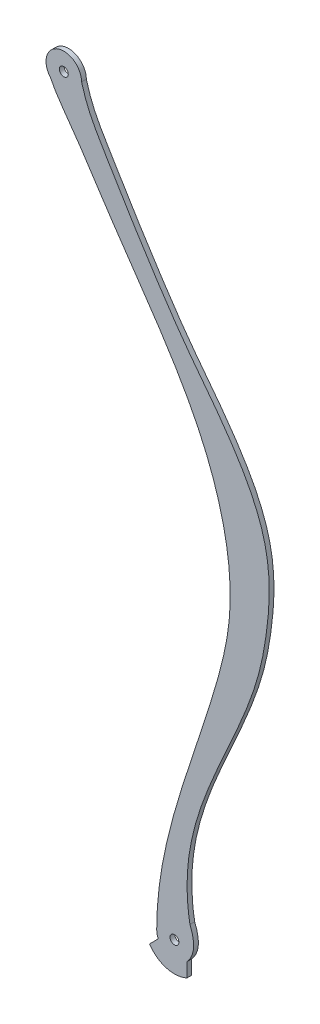
ISO-10303-21;
HEADER;
FILE_DESCRIPTION(('STEP AP214'),'2;1');
FILE_NAME('part.step','',(''),(''),'','','');
FILE_SCHEMA(('AUTOMOTIVE_DESIGN { 1 0 10303 214 1 1 1 1 }'));
ENDSEC;
DATA;
#1=APPLICATION_CONTEXT('core data for automotive mechanical design processes');
#2=APPLICATION_PROTOCOL_DEFINITION('international standard','automotive_design',2000,#1);
#3=PRODUCT_CONTEXT('',#1,'mechanical');
#4=PRODUCT('Part','Part','',(#3));
#5=PRODUCT_RELATED_PRODUCT_CATEGORY('part','',(#4));
#6=PRODUCT_DEFINITION_FORMATION('','',#4);
#7=PRODUCT_DEFINITION_CONTEXT('part definition',#1,'design');
#8=PRODUCT_DEFINITION('design','',#6,#7);
#9=PRODUCT_DEFINITION_SHAPE('','',#8);
#10=(LENGTH_UNIT() NAMED_UNIT(*) SI_UNIT(.MILLI.,.METRE.));
#11=(NAMED_UNIT(*) PLANE_ANGLE_UNIT() SI_UNIT($,.RADIAN.));
#12=(NAMED_UNIT(*) SI_UNIT($,.STERADIAN.) SOLID_ANGLE_UNIT());
#13=UNCERTAINTY_MEASURE_WITH_UNIT(LENGTH_MEASURE(1.E-05),#10,'distance_accuracy_value','');
#14=(GEOMETRIC_REPRESENTATION_CONTEXT(3) GLOBAL_UNCERTAINTY_ASSIGNED_CONTEXT((#13)) GLOBAL_UNIT_ASSIGNED_CONTEXT((#10,
#11,#12)) REPRESENTATION_CONTEXT('',''));
#15=CARTESIAN_POINT('',(0.,0.,0.));
#16=DIRECTION('',(0.,0.,1.));
#17=DIRECTION('',(1.,0.,0.));
#18=AXIS2_PLACEMENT_3D('',#15,#16,#17);
#19=CARTESIAN_POINT('',(42.5704411222653,-227.946776929195,1.6));
#20=CARTESIAN_POINT('',(45.4783553267568,-234.955262518394,1.6));
#21=CARTESIAN_POINT('',(41.5394779205616,-239.288693536524,1.6));
#22=B_SPLINE_CURVE_WITH_KNOTS('',2,(#19,#20,#21),.UNSPECIFIED.,.F.,.F.,(3,3),(0.,1.),.UNSPECIFIED.);
#23=DIRECTION('',(0.,0.,-1.));
#24=VECTOR('',#23,1.);
#25=SURFACE_OF_LINEAR_EXTRUSION('',#22,#24);
#26=CARTESIAN_POINT('',(42.5704411222653,-227.946776929195,0.));
#27=CARTESIAN_POINT('',(45.4783553267568,-234.955262518394,0.));
#28=CARTESIAN_POINT('',(41.5394779205616,-239.288693536524,0.));
#29=B_SPLINE_CURVE_WITH_KNOTS('',2,(#26,#27,#28),.UNSPECIFIED.,.F.,.F.,(3,3),(0.,1.),.UNSPECIFIED.);
#30=CARTESIAN_POINT('',(42.5704411222653,-227.946776929195,0.));
#31=VERTEX_POINT('',#30);
#32=CARTESIAN_POINT('',(41.5394779205616,-239.288693536524,0.));
#33=VERTEX_POINT('',#32);
#34=EDGE_CURVE('E138',#31,#33,#29,.T.);
#35=ORIENTED_EDGE('',*,*,#34,.F.);
#36=DIRECTION('',(0.,0.,-1.));
#37=VECTOR('',#36,1.);
#38=CARTESIAN_POINT('',(42.5704411222653,-227.946776929195,1.6));
#39=LINE('',#38,#37);
#40=CARTESIAN_POINT('',(42.5704411222653,-227.946776929195,1.6));
#41=VERTEX_POINT('',#40);
#42=EDGE_CURVE('E11',#41,#31,#39,.T.);
#43=ORIENTED_EDGE('',*,*,#42,.F.);
#44=CARTESIAN_POINT('',(41.5394779205616,-239.288693536524,1.6));
#45=VERTEX_POINT('',#44);
#46=EDGE_CURVE('E177',#41,#45,#22,.T.);
#47=ORIENTED_EDGE('',*,*,#46,.T.);
#48=DIRECTION('',(0.,0.,-1.));
#49=VECTOR('',#48,1.);
#50=CARTESIAN_POINT('',(41.5394779205616,-239.288693536524,1.6));
#51=LINE('',#50,#49);
#52=EDGE_CURVE('E53',#45,#33,#51,.T.);
#53=ORIENTED_EDGE('',*,*,#52,.T.);
#54=EDGE_LOOP('',(#35,#43,#47,#53));
#55=FACE_BOUND('',#54,.T.);
#56=ADVANCED_FACE('F36',(#55),#25,.T.);
#57=CARTESIAN_POINT('',(6.,0.,1.6));
#58=CARTESIAN_POINT('',(7.76386208286006,-6.61193534295752,1.6));
#59=CARTESIAN_POINT('',(16.7739174488545,-21.8118978722191,1.6));
#60=CARTESIAN_POINT('',(27.4635683429947,-39.5793997627197,1.6));
#61=CARTESIAN_POINT('',(42.0147268676152,-60.9068216002465,1.6));
#62=CARTESIAN_POINT('',(50.4000416978606,-71.2722804910203,1.6));
#63=CARTESIAN_POINT('',(68.5781614765407,-97.575861314017,1.6));
#64=CARTESIAN_POINT('',(71.3531265188425,-113.361048841766,1.6));
#65=CARTESIAN_POINT('',(61.9761604637949,-167.143867847091,1.6));
#66=CARTESIAN_POINT('',(36.5746544062889,-194.797637863706,1.6));
#67=CARTESIAN_POINT('',(42.5704411222653,-227.946776929195,1.6));
#68=B_SPLINE_CURVE_WITH_KNOTS('',3,(#57,#58,#59,#60,#61,#62,#63,#64,#65,#66,#67),.UNSPECIFIED.,
.F.,.F.,(4,1,1,1,1,1,1,1,4),(0.,0.0683192614589029,0.240751678098302,0.269358498196008,
0.344939799742638,0.384133739371875,0.622103954859139,0.655427619881835,1.),.UNSPECIFIED.);
#69=DIRECTION('',(0.,0.,-1.));
#70=VECTOR('',#69,1.);
#71=SURFACE_OF_LINEAR_EXTRUSION('',#68,#70);
#72=CARTESIAN_POINT('',(6.,0.,0.));
#73=CARTESIAN_POINT('',(7.76386208286006,-6.61193534295752,0.));
#74=CARTESIAN_POINT('',(16.7739174488545,-21.8118978722191,0.));
#75=CARTESIAN_POINT('',(27.4635683429947,-39.5793997627197,0.));
#76=CARTESIAN_POINT('',(42.0147268676152,-60.9068216002465,0.));
#77=CARTESIAN_POINT('',(50.4000416978606,-71.2722804910203,0.));
#78=CARTESIAN_POINT('',(68.5781614765407,-97.575861314017,0.));
#79=CARTESIAN_POINT('',(71.3531265188425,-113.361048841766,0.));
#80=CARTESIAN_POINT('',(61.9761604637949,-167.143867847091,0.));
#81=CARTESIAN_POINT('',(36.5746544062889,-194.797637863706,0.));
#82=CARTESIAN_POINT('',(42.5704411222653,-227.946776929195,0.));
#83=B_SPLINE_CURVE_WITH_KNOTS('',3,(#72,#73,#74,#75,#76,#77,#78,#79,#80,#81,#82),.UNSPECIFIED.,
.F.,.F.,(4,1,1,1,1,1,1,1,4),(0.,0.0683192614589029,0.240751678098302,0.269358498196008,
0.344939799742638,0.384133739371875,0.622103954859139,0.655427619881835,1.),.UNSPECIFIED.);
#84=CARTESIAN_POINT('',(6.,0.,0.));
#85=VERTEX_POINT('',#84);
#86=EDGE_CURVE('E142',#85,#31,#83,.T.);
#87=ORIENTED_EDGE('',*,*,#86,.F.);
#88=DIRECTION('',(0.,0.,-1.));
#89=VECTOR('',#88,1.);
#90=CARTESIAN_POINT('',(6.,0.,1.6));
#91=LINE('',#90,#89);
#92=CARTESIAN_POINT('',(6.,0.,1.6));
#93=VERTEX_POINT('',#92);
#94=EDGE_CURVE('E45',#93,#85,#91,.T.);
#95=ORIENTED_EDGE('',*,*,#94,.F.);
#96=EDGE_CURVE('E202',#93,#41,#68,.T.);
#97=ORIENTED_EDGE('',*,*,#96,.T.);
#98=ORIENTED_EDGE('',*,*,#42,.T.);
#99=EDGE_LOOP('',(#87,#95,#97,#98));
#100=FACE_BOUND('',#99,.T.);
#101=ADVANCED_FACE('F201',(#100),#71,.T.);
#102=CARTESIAN_POINT('',(0.,0.,1.6));
#103=DIRECTION('',(0.,0.,-1.));
#104=DIRECTION('',(-1.,0.,0.));
#105=AXIS2_PLACEMENT_3D('',#102,#103,#104);
#106=CYLINDRICAL_SURFACE('',#105,6.);
#107=CARTESIAN_POINT('',(0.,0.,0.));
#108=DIRECTION('',(0.,0.,1.));
#109=DIRECTION('',(1.,0.,0.));
#110=AXIS2_PLACEMENT_3D('',#107,#108,#109);
#111=CIRCLE('',#110,6.);
#112=CARTESIAN_POINT('',(-4.4798144967741,-3.99139851111018,0.));
#113=VERTEX_POINT('',#112);
#114=EDGE_CURVE('E150',#85,#113,#111,.T.);
#115=ORIENTED_EDGE('',*,*,#114,.T.);
#116=DIRECTION('',(0.,0.,-1.));
#117=VECTOR('',#116,1.);
#118=CARTESIAN_POINT('',(-4.4798144967741,-3.99139851111018,1.6));
#119=LINE('',#118,#117);
#120=CARTESIAN_POINT('',(-4.4798144967741,-3.99139851111018,1.6));
#121=VERTEX_POINT('',#120);
#122=EDGE_CURVE('E184',#121,#113,#119,.T.);
#123=ORIENTED_EDGE('',*,*,#122,.F.);
#124=CARTESIAN_POINT('',(0.,0.,1.6));
#125=DIRECTION('',(0.,0.,1.));
#126=DIRECTION('',(1.,0.,0.));
#127=AXIS2_PLACEMENT_3D('',#124,#125,#126);
#128=CIRCLE('',#127,6.);
#129=EDGE_CURVE('E191',#93,#121,#128,.T.);
#130=ORIENTED_EDGE('',*,*,#129,.F.);
#131=ORIENTED_EDGE('',*,*,#94,.T.);
#132=EDGE_LOOP('',(#115,#123,#130,#131));
#133=FACE_BOUND('',#132,.T.);
#134=ADVANCED_FACE('F189',(#133),#106,.T.);
#135=CARTESIAN_POINT('',(-4.4798144967741,-3.99139851111018,1.6));
#136=CARTESIAN_POINT('',(-2.84838487567931,-7.43979884449677,1.6));
#137=CARTESIAN_POINT('',(4.36676713544047,-16.8942488774789,1.6));
#138=CARTESIAN_POINT('',(22.2675687815332,-45.5318443283706,1.6));
#139=CARTESIAN_POINT('',(49.5545722076309,-80.5433327382024,1.6));
#140=CARTESIAN_POINT('',(58.7070886496613,-124.756359647823,1.6));
#141=CARTESIAN_POINT('',(46.7827591376071,-173.478130540099,1.6));
#142=CARTESIAN_POINT('',(31.3878425658591,-206.976572759324,1.6));
#143=CARTESIAN_POINT('',(31.3433954917025,-235.,1.6));
#144=B_SPLINE_CURVE_WITH_KNOTS('',3,(#135,#136,#137,#138,#139,#140,#141,#142,#143),
.UNSPECIFIED.,.F.,.F.,(4,1,1,1,1,1,4),(0.0158945336217027,0.0599627114776733,0.161342902171643,
0.40983356742642,0.582005186834429,0.66809639181976,1.),.UNSPECIFIED.);
#145=DIRECTION('',(0.,0.,-1.));
#146=VECTOR('',#145,1.);
#147=SURFACE_OF_LINEAR_EXTRUSION('',#144,#146);
#148=CARTESIAN_POINT('',(-4.4798144967741,-3.99139851111018,0.));
#149=CARTESIAN_POINT('',(-2.84838487567931,-7.43979884449677,0.));
#150=CARTESIAN_POINT('',(4.36676713544047,-16.8942488774789,0.));
#151=CARTESIAN_POINT('',(22.2675687815332,-45.5318443283706,0.));
#152=CARTESIAN_POINT('',(49.5545722076309,-80.5433327382024,0.));
#153=CARTESIAN_POINT('',(58.7070886496613,-124.756359647823,0.));
#154=CARTESIAN_POINT('',(46.7827591376071,-173.478130540099,0.));
#155=CARTESIAN_POINT('',(31.3878425658591,-206.976572759324,0.));
#156=CARTESIAN_POINT('',(31.3433954917025,-235.,0.));
#157=B_SPLINE_CURVE_WITH_KNOTS('',3,(#148,#149,#150,#151,#152,#153,#154,#155,#156),
.UNSPECIFIED.,.F.,.F.,(4,1,1,1,1,1,4),(0.0158945336217027,0.0599627114776733,0.161342902171643,
0.40983356742642,0.582005186834429,0.66809639181976,1.),.UNSPECIFIED.);
#158=CARTESIAN_POINT('',(31.3433954917025,-235.,0.));
#159=VERTEX_POINT('',#158);
#160=EDGE_CURVE('E155',#113,#159,#157,.T.);
#161=ORIENTED_EDGE('',*,*,#160,.T.);
#162=DIRECTION('',(0.,0.,-1.));
#163=VECTOR('',#162,1.);
#164=CARTESIAN_POINT('',(31.3433954917025,-235.,1.6));
#165=LINE('',#164,#163);
#166=CARTESIAN_POINT('',(31.3433954917025,-235.,1.6));
#167=VERTEX_POINT('',#166);
#168=EDGE_CURVE('E181',#167,#159,#165,.T.);
#169=ORIENTED_EDGE('',*,*,#168,.F.);
#170=EDGE_CURVE('E127',#121,#167,#144,.T.);
#171=ORIENTED_EDGE('',*,*,#170,.F.);
#172=ORIENTED_EDGE('',*,*,#122,.T.);
#173=EDGE_LOOP('',(#161,#169,#171,#172));
#174=FACE_BOUND('',#173,.T.);
#175=ADVANCED_FACE('F224',(#174),#147,.F.);
#176=CARTESIAN_POINT('',(37.3433954917025,-235.,1.6));
#177=DIRECTION('',(0.,0.,-1.));
#178=DIRECTION('',(-1.,0.,0.));
#179=AXIS2_PLACEMENT_3D('',#176,#177,#178);
#180=CYLINDRICAL_SURFACE('',#179,6.);
#181=CARTESIAN_POINT('',(37.3433954917025,-235.,0.));
#182=DIRECTION('',(0.,0.,1.));
#183=DIRECTION('',(1.,0.,0.));
#184=AXIS2_PLACEMENT_3D('',#181,#182,#183);
#185=CIRCLE('',#184,6.);
#186=CARTESIAN_POINT('',(31.8763485175275,-237.472124062859,0.));
#187=VERTEX_POINT('',#186);
#188=EDGE_CURVE('E159',#159,#187,#185,.T.);
#189=ORIENTED_EDGE('',*,*,#188,.T.);
#190=DIRECTION('',(0.,0.,-1.));
#191=VECTOR('',#190,1.);
#192=CARTESIAN_POINT('',(31.8763485175275,-237.472124062859,1.6));
#193=LINE('',#192,#191);
#194=CARTESIAN_POINT('',(31.8763485175275,-237.472124062859,1.6));
#195=VERTEX_POINT('',#194);
#196=EDGE_CURVE('E113',#195,#187,#193,.T.);
#197=ORIENTED_EDGE('',*,*,#196,.F.);
#198=CARTESIAN_POINT('',(37.3433954917025,-235.,1.6));
#199=DIRECTION('',(0.,0.,1.));
#200=DIRECTION('',(1.,0.,0.));
#201=AXIS2_PLACEMENT_3D('',#198,#199,#200);
#202=CIRCLE('',#201,6.);
#203=EDGE_CURVE('E124',#167,#195,#202,.T.);
#204=ORIENTED_EDGE('',*,*,#203,.F.);
#205=ORIENTED_EDGE('',*,*,#168,.T.);
#206=EDGE_LOOP('',(#189,#197,#204,#205));
#207=FACE_BOUND('',#206,.T.);
#208=ADVANCED_FACE('F246',(#207),#180,.T.);
#209=CARTESIAN_POINT('',(134.674236290193,-134.674236290192,1.6));
#210=DIRECTION('',(-0.70710678118655,0.707106781186545,0.));
#211=DIRECTION('',(-0.707106781186545,-0.70710678118655,0.));
#212=AXIS2_PLACEMENT_3D('',#209,#210,#211);
#213=PLANE('',#212);
#214=DIRECTION('',(0.707106781186545,0.70710678118655,0.));
#215=VECTOR('',#214,1.);
#216=CARTESIAN_POINT('',(134.674236290193,-134.674236290192,0.));
#217=LINE('',#216,#215);
#218=CARTESIAN_POINT('',(28.9352459958548,-240.413226584531,0.));
#219=VERTEX_POINT('',#218);
#220=EDGE_CURVE('E110',#219,#187,#217,.T.);
#221=ORIENTED_EDGE('',*,*,#220,.F.);
#222=DIRECTION('',(0.,0.,-1.));
#223=VECTOR('',#222,1.);
#224=CARTESIAN_POINT('',(28.9352459958548,-240.413226584531,1.6));
#225=LINE('',#224,#223);
#226=CARTESIAN_POINT('',(28.9352459958548,-240.413226584531,1.6));
#227=VERTEX_POINT('',#226);
#228=EDGE_CURVE('E104',#227,#219,#225,.T.);
#229=ORIENTED_EDGE('',*,*,#228,.F.);
#230=DIRECTION('',(0.707106781186545,0.70710678118655,0.));
#231=VECTOR('',#230,1.);
#232=CARTESIAN_POINT('',(134.674236290193,-134.674236290192,1.6));
#233=LINE('',#232,#231);
#234=EDGE_CURVE('E108',#227,#195,#233,.T.);
#235=ORIENTED_EDGE('',*,*,#234,.T.);
#236=ORIENTED_EDGE('',*,*,#196,.T.);
#237=EDGE_LOOP('',(#221,#229,#235,#236));
#238=FACE_BOUND('',#237,.T.);
#239=ADVANCED_FACE('F106',(#238),#213,.T.);
#240=CARTESIAN_POINT('',(37.3433954917025,-235.,1.6));
#241=DIRECTION('',(0.,0.,-1.));
#242=DIRECTION('',(-1.,0.,0.));
#243=AXIS2_PLACEMENT_3D('',#240,#241,#242);
#244=CYLINDRICAL_SURFACE('',#243,10.);
#245=CARTESIAN_POINT('',(37.3433954917025,-235.,0.));
#246=DIRECTION('',(0.,0.,1.));
#247=DIRECTION('',(1.,0.,0.));
#248=AXIS2_PLACEMENT_3D('',#245,#246,#247);
#249=CIRCLE('',#248,10.);
#250=CARTESIAN_POINT('',(41.5394779205616,-244.077053059789,0.));
#251=VERTEX_POINT('',#250);
#252=EDGE_CURVE('E166',#219,#251,#249,.T.);
#253=ORIENTED_EDGE('',*,*,#252,.T.);
#254=DIRECTION('',(0.,0.,-1.));
#255=VECTOR('',#254,1.);
#256=CARTESIAN_POINT('',(41.5394779205616,-244.077053059789,1.6));
#257=LINE('',#256,#255);
#258=CARTESIAN_POINT('',(41.5394779205616,-244.077053059789,1.6));
#259=VERTEX_POINT('',#258);
#260=EDGE_CURVE('E79',#259,#251,#257,.T.);
#261=ORIENTED_EDGE('',*,*,#260,.F.);
#262=CARTESIAN_POINT('',(37.3433954917025,-235.,1.6));
#263=DIRECTION('',(0.,0.,1.));
#264=DIRECTION('',(1.,0.,0.));
#265=AXIS2_PLACEMENT_3D('',#262,#263,#264);
#266=CIRCLE('',#265,10.);
#267=EDGE_CURVE('E115',#227,#259,#266,.T.);
#268=ORIENTED_EDGE('',*,*,#267,.F.);
#269=ORIENTED_EDGE('',*,*,#228,.T.);
#270=EDGE_LOOP('',(#253,#261,#268,#269));
#271=FACE_BOUND('',#270,.T.);
#272=ADVANCED_FACE('F116',(#271),#244,.T.);
#273=CARTESIAN_POINT('',(37.3433954917025,-235.,1.6));
#274=DIRECTION('',(0.,0.,-1.));
#275=DIRECTION('',(-1.,0.,0.));
#276=AXIS2_PLACEMENT_3D('',#273,#274,#275);
#277=CYLINDRICAL_SURFACE('',#276,1.5);
#278=CARTESIAN_POINT('',(37.3433954917025,-235.,1.6));
#279=DIRECTION('',(0.,0.,1.));
#280=DIRECTION('',(1.,0.,0.));
#281=AXIS2_PLACEMENT_3D('',#278,#279,#280);
#282=CIRCLE('',#281,1.5);
#283=CARTESIAN_POINT('',(38.8433954917025,-235.,1.6));
#284=VERTEX_POINT('',#283);
#285=EDGE_CURVE('E132',#284,#284,#282,.T.);
#286=ORIENTED_EDGE('',*,*,#285,.T.);
#287=EDGE_LOOP('',(#286));
#288=FACE_BOUND('',#287,.T.);
#289=CARTESIAN_POINT('',(37.3433954917025,-235.,0.));
#290=DIRECTION('',(0.,0.,1.));
#291=DIRECTION('',(1.,0.,0.));
#292=AXIS2_PLACEMENT_3D('',#289,#290,#291);
#293=CIRCLE('',#292,1.5);
#294=CARTESIAN_POINT('',(38.8433954917025,-235.,0.));
#295=VERTEX_POINT('',#294);
#296=EDGE_CURVE('E171',#295,#295,#293,.T.);
#297=ORIENTED_EDGE('',*,*,#296,.F.);
#298=EDGE_LOOP('',(#297));
#299=FACE_BOUND('',#298,.T.);
#300=ADVANCED_FACE('F206',(#288,#299),#277,.F.);
#301=CARTESIAN_POINT('',(41.5394779205616,0.,1.6));
#302=DIRECTION('',(1.,0.,0.));
#303=DIRECTION('',(0.,0.,-1.));
#304=AXIS2_PLACEMENT_3D('',#301,#302,#303);
#305=PLANE('',#304);
#306=DIRECTION('',(0.,-1.,0.));
#307=VECTOR('',#306,1.);
#308=CARTESIAN_POINT('',(41.5394779205616,0.,0.));
#309=LINE('',#308,#307);
#310=EDGE_CURVE('E168',#33,#251,#309,.T.);
#311=ORIENTED_EDGE('',*,*,#310,.F.);
#312=ORIENTED_EDGE('',*,*,#52,.F.);
#313=DIRECTION('',(0.,-1.,0.));
#314=VECTOR('',#313,1.);
#315=CARTESIAN_POINT('',(41.5394779205616,0.,1.6));
#316=LINE('',#315,#314);
#317=EDGE_CURVE('E119',#45,#259,#316,.T.);
#318=ORIENTED_EDGE('',*,*,#317,.T.);
#319=ORIENTED_EDGE('',*,*,#260,.T.);
#320=EDGE_LOOP('',(#311,#312,#318,#319));
#321=FACE_BOUND('',#320,.T.);
#322=ADVANCED_FACE('F203',(#321),#305,.T.);
#323=CARTESIAN_POINT('',(0.,0.,1.6));
#324=DIRECTION('',(0.,0.,-1.));
#325=DIRECTION('',(-1.,0.,0.));
#326=AXIS2_PLACEMENT_3D('',#323,#324,#325);
#327=CYLINDRICAL_SURFACE('',#326,1.5);
#328=CARTESIAN_POINT('',(0.,0.,1.6));
#329=DIRECTION('',(0.,0.,1.));
#330=DIRECTION('',(1.,0.,0.));
#331=AXIS2_PLACEMENT_3D('',#328,#329,#330);
#332=CIRCLE('',#331,1.5);
#333=CARTESIAN_POINT('',(1.5,0.,1.6));
#334=VERTEX_POINT('',#333);
#335=EDGE_CURVE('E135',#334,#334,#332,.T.);
#336=ORIENTED_EDGE('',*,*,#335,.T.);
#337=EDGE_LOOP('',(#336));
#338=FACE_BOUND('',#337,.T.);
#339=CARTESIAN_POINT('',(0.,0.,0.));
#340=DIRECTION('',(0.,0.,1.));
#341=DIRECTION('',(1.,0.,0.));
#342=AXIS2_PLACEMENT_3D('',#339,#340,#341);
#343=CIRCLE('',#342,1.5);
#344=CARTESIAN_POINT('',(1.5,0.,0.));
#345=VERTEX_POINT('',#344);
#346=EDGE_CURVE('E174',#345,#345,#343,.T.);
#347=ORIENTED_EDGE('',*,*,#346,.F.);
#348=EDGE_LOOP('',(#347));
#349=FACE_BOUND('',#348,.T.);
#350=ADVANCED_FACE('F205',(#338,#349),#327,.F.);
#351=CARTESIAN_POINT('',(0.,0.,1.6));
#352=DIRECTION('',(0.,0.,1.));
#353=DIRECTION('',(1.,0.,0.));
#354=AXIS2_PLACEMENT_3D('',#351,#352,#353);
#355=PLANE('',#354);
#356=ORIENTED_EDGE('',*,*,#46,.F.);
#357=ORIENTED_EDGE('',*,*,#96,.F.);
#358=ORIENTED_EDGE('',*,*,#129,.T.);
#359=ORIENTED_EDGE('',*,*,#170,.T.);
#360=ORIENTED_EDGE('',*,*,#203,.T.);
#361=ORIENTED_EDGE('',*,*,#234,.F.);
#362=ORIENTED_EDGE('',*,*,#267,.T.);
#363=ORIENTED_EDGE('',*,*,#317,.F.);
#364=EDGE_LOOP('',(#356,#357,#358,#359,#360,#361,#362,#363));
#365=FACE_BOUND('',#364,.T.);
#366=ORIENTED_EDGE('',*,*,#285,.F.);
#367=EDGE_LOOP('',(#366));
#368=FACE_BOUND('',#367,.T.);
#369=ORIENTED_EDGE('',*,*,#335,.F.);
#370=EDGE_LOOP('',(#369));
#371=FACE_BOUND('',#370,.T.);
#372=ADVANCED_FACE('F121',(#365,#368,#371),#355,.T.);
#373=CARTESIAN_POINT('',(0.,0.,0.));
#374=DIRECTION('',(0.,0.,1.));
#375=DIRECTION('',(1.,0.,0.));
#376=AXIS2_PLACEMENT_3D('',#373,#374,#375);
#377=PLANE('',#376);
#378=ORIENTED_EDGE('',*,*,#34,.T.);
#379=ORIENTED_EDGE('',*,*,#310,.T.);
#380=ORIENTED_EDGE('',*,*,#252,.F.);
#381=ORIENTED_EDGE('',*,*,#220,.T.);
#382=ORIENTED_EDGE('',*,*,#188,.F.);
#383=ORIENTED_EDGE('',*,*,#160,.F.);
#384=ORIENTED_EDGE('',*,*,#114,.F.);
#385=ORIENTED_EDGE('',*,*,#86,.T.);
#386=EDGE_LOOP('',(#378,#379,#380,#381,#382,#383,#384,#385));
#387=FACE_BOUND('',#386,.T.);
#388=ORIENTED_EDGE('',*,*,#296,.T.);
#389=EDGE_LOOP('',(#388));
#390=FACE_BOUND('',#389,.T.);
#391=ORIENTED_EDGE('',*,*,#346,.T.);
#392=EDGE_LOOP('',(#391));
#393=FACE_BOUND('',#392,.T.);
#394=ADVANCED_FACE('F198',(#387,#390,#393),#377,.F.);
#395=CLOSED_SHELL('',(#56,#101,#134,#175,#208,#239,#272,#300,#322,#350,#372,#394));
#396=MANIFOLD_SOLID_BREP('B2',#395);
#397=ADVANCED_BREP_SHAPE_REPRESENTATION('',(#18,#396),#14);
#398=SHAPE_DEFINITION_REPRESENTATION(#9,#397);
ENDSEC;
END-ISO-10303-21;
